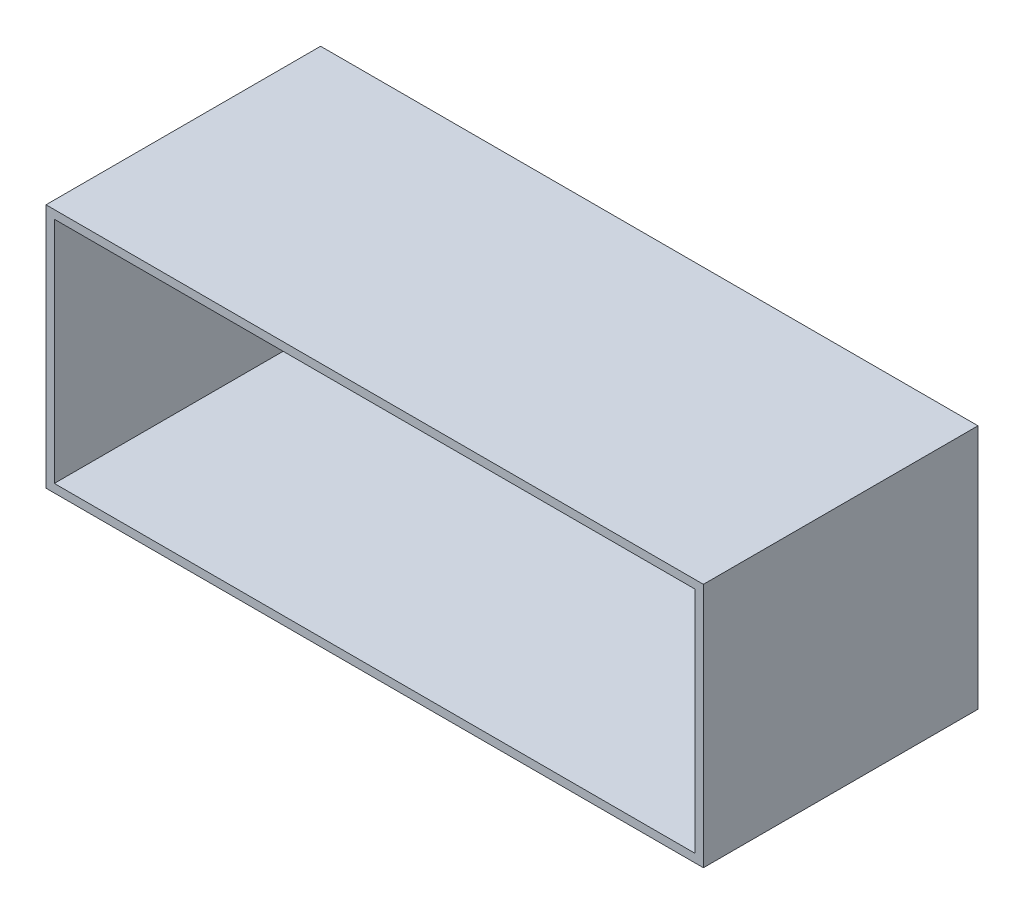
ISO-10303-21;
HEADER;
FILE_DESCRIPTION(('STEP AP214'),'2;1');
FILE_NAME('part.step','',(''),(''),'','','');
FILE_SCHEMA(('AUTOMOTIVE_DESIGN { 1 0 10303 214 1 1 1 1 }'));
ENDSEC;
DATA;
#1=APPLICATION_CONTEXT('core data for automotive mechanical design processes');
#2=APPLICATION_PROTOCOL_DEFINITION('international standard','automotive_design',2000,#1);
#3=PRODUCT_CONTEXT('',#1,'mechanical');
#4=PRODUCT('Part','Part','',(#3));
#5=PRODUCT_RELATED_PRODUCT_CATEGORY('part','',(#4));
#6=PRODUCT_DEFINITION_FORMATION('','',#4);
#7=PRODUCT_DEFINITION_CONTEXT('part definition',#1,'design');
#8=PRODUCT_DEFINITION('design','',#6,#7);
#9=PRODUCT_DEFINITION_SHAPE('','',#8);
#10=(LENGTH_UNIT() NAMED_UNIT(*) SI_UNIT(.MILLI.,.METRE.));
#11=(NAMED_UNIT(*) PLANE_ANGLE_UNIT() SI_UNIT($,.RADIAN.));
#12=(NAMED_UNIT(*) SI_UNIT($,.STERADIAN.) SOLID_ANGLE_UNIT());
#13=UNCERTAINTY_MEASURE_WITH_UNIT(LENGTH_MEASURE(1.E-05),#10,'distance_accuracy_value','');
#14=(GEOMETRIC_REPRESENTATION_CONTEXT(3) GLOBAL_UNCERTAINTY_ASSIGNED_CONTEXT((#13)) GLOBAL_UNIT_ASSIGNED_CONTEXT((#10,
#11,#12)) REPRESENTATION_CONTEXT('',''));
#15=CARTESIAN_POINT('',(0.,0.,0.));
#16=DIRECTION('',(0.,0.,1.));
#17=DIRECTION('',(1.,0.,0.));
#18=AXIS2_PLACEMENT_3D('',#15,#16,#17);
#19=CARTESIAN_POINT('',(0.,0.,66.));
#20=DIRECTION('',(0.,0.,-1.));
#21=DIRECTION('',(-1.,0.,0.));
#22=AXIS2_PLACEMENT_3D('',#19,#20,#21);
#23=PLANE('',#22);
#24=DIRECTION('',(0.,-1.,0.));
#25=VECTOR('',#24,1.);
#26=CARTESIAN_POINT('',(0.,0.,66.));
#27=LINE('',#26,#25);
#28=CARTESIAN_POINT('',(0.,59.,66.));
#29=VERTEX_POINT('',#28);
#30=CARTESIAN_POINT('',(0.,0.,66.));
#31=VERTEX_POINT('',#30);
#32=EDGE_CURVE('E144',#29,#31,#27,.T.);
#33=ORIENTED_EDGE('',*,*,#32,.T.);
#34=DIRECTION('',(1.,0.,0.));
#35=VECTOR('',#34,1.);
#36=CARTESIAN_POINT('',(0.,0.,66.));
#37=LINE('',#36,#35);
#38=CARTESIAN_POINT('',(158.,0.,66.));
#39=VERTEX_POINT('',#38);
#40=EDGE_CURVE('E149',#31,#39,#37,.T.);
#41=ORIENTED_EDGE('',*,*,#40,.T.);
#42=DIRECTION('',(0.,1.,0.));
#43=VECTOR('',#42,1.);
#44=CARTESIAN_POINT('',(158.,0.,66.));
#45=LINE('',#44,#43);
#46=CARTESIAN_POINT('',(158.,59.,66.));
#47=VERTEX_POINT('',#46);
#48=EDGE_CURVE('E152',#39,#47,#45,.T.);
#49=ORIENTED_EDGE('',*,*,#48,.T.);
#50=DIRECTION('',(-1.,0.,0.));
#51=VECTOR('',#50,1.);
#52=CARTESIAN_POINT('',(0.,59.,66.));
#53=LINE('',#52,#51);
#54=EDGE_CURVE('E153',#47,#29,#53,.T.);
#55=ORIENTED_EDGE('',*,*,#54,.T.);
#56=EDGE_LOOP('',(#33,#41,#49,#55));
#57=FACE_BOUND('',#56,.T.);
#58=DIRECTION('',(0.,-1.,0.));
#59=VECTOR('',#58,1.);
#60=CARTESIAN_POINT('',(2.,2.,66.));
#61=LINE('',#60,#59);
#62=CARTESIAN_POINT('',(2.,57.,66.));
#63=VERTEX_POINT('',#62);
#64=CARTESIAN_POINT('',(2.,2.,66.));
#65=VERTEX_POINT('',#64);
#66=EDGE_CURVE('E126',#63,#65,#61,.T.);
#67=ORIENTED_EDGE('',*,*,#66,.F.);
#68=DIRECTION('',(-1.,0.,0.));
#69=VECTOR('',#68,1.);
#70=CARTESIAN_POINT('',(2.,57.,66.));
#71=LINE('',#70,#69);
#72=CARTESIAN_POINT('',(156.,57.,66.));
#73=VERTEX_POINT('',#72);
#74=EDGE_CURVE('E118',#73,#63,#71,.T.);
#75=ORIENTED_EDGE('',*,*,#74,.F.);
#76=DIRECTION('',(0.,1.,0.));
#77=VECTOR('',#76,1.);
#78=CARTESIAN_POINT('',(156.,2.,66.));
#79=LINE('',#78,#77);
#80=CARTESIAN_POINT('',(156.,2.,66.));
#81=VERTEX_POINT('',#80);
#82=EDGE_CURVE('E136',#81,#73,#79,.T.);
#83=ORIENTED_EDGE('',*,*,#82,.F.);
#84=DIRECTION('',(1.,0.,0.));
#85=VECTOR('',#84,1.);
#86=CARTESIAN_POINT('',(2.,2.,66.));
#87=LINE('',#86,#85);
#88=EDGE_CURVE('E127',#65,#81,#87,.T.);
#89=ORIENTED_EDGE('',*,*,#88,.F.);
#90=EDGE_LOOP('',(#67,#75,#83,#89));
#91=FACE_BOUND('',#90,.T.);
#92=ADVANCED_FACE('F43',(#57,#91),#23,.F.);
#93=CARTESIAN_POINT('',(0.,0.,0.));
#94=DIRECTION('',(0.,0.,-1.));
#95=DIRECTION('',(-1.,0.,0.));
#96=AXIS2_PLACEMENT_3D('',#93,#94,#95);
#97=PLANE('',#96);
#98=DIRECTION('',(0.,-1.,0.));
#99=VECTOR('',#98,1.);
#100=CARTESIAN_POINT('',(0.,0.,0.));
#101=LINE('',#100,#99);
#102=CARTESIAN_POINT('',(0.,59.,0.));
#103=VERTEX_POINT('',#102);
#104=CARTESIAN_POINT('',(0.,0.,0.));
#105=VERTEX_POINT('',#104);
#106=EDGE_CURVE('E143',#103,#105,#101,.T.);
#107=ORIENTED_EDGE('',*,*,#106,.F.);
#108=DIRECTION('',(-1.,0.,0.));
#109=VECTOR('',#108,1.);
#110=CARTESIAN_POINT('',(0.,59.,0.));
#111=LINE('',#110,#109);
#112=CARTESIAN_POINT('',(158.,59.,0.));
#113=VERTEX_POINT('',#112);
#114=EDGE_CURVE('E146',#113,#103,#111,.T.);
#115=ORIENTED_EDGE('',*,*,#114,.F.);
#116=DIRECTION('',(0.,1.,0.));
#117=VECTOR('',#116,1.);
#118=CARTESIAN_POINT('',(158.,0.,0.));
#119=LINE('',#118,#117);
#120=CARTESIAN_POINT('',(158.,0.,0.));
#121=VERTEX_POINT('',#120);
#122=EDGE_CURVE('E158',#121,#113,#119,.T.);
#123=ORIENTED_EDGE('',*,*,#122,.F.);
#124=DIRECTION('',(1.,0.,0.));
#125=VECTOR('',#124,1.);
#126=CARTESIAN_POINT('',(0.,0.,0.));
#127=LINE('',#126,#125);
#128=EDGE_CURVE('E156',#105,#121,#127,.T.);
#129=ORIENTED_EDGE('',*,*,#128,.F.);
#130=EDGE_LOOP('',(#107,#115,#123,#129));
#131=FACE_BOUND('',#130,.T.);
#132=ADVANCED_FACE('F178',(#131),#97,.T.);
#133=CARTESIAN_POINT('',(0.,0.,66.));
#134=DIRECTION('',(1.,0.,0.));
#135=DIRECTION('',(0.,0.,-1.));
#136=AXIS2_PLACEMENT_3D('',#133,#134,#135);
#137=PLANE('',#136);
#138=ORIENTED_EDGE('',*,*,#106,.T.);
#139=DIRECTION('',(0.,0.,-1.));
#140=VECTOR('',#139,1.);
#141=CARTESIAN_POINT('',(0.,0.,66.));
#142=LINE('',#141,#140);
#143=EDGE_CURVE('E11',#31,#105,#142,.T.);
#144=ORIENTED_EDGE('',*,*,#143,.F.);
#145=ORIENTED_EDGE('',*,*,#32,.F.);
#146=DIRECTION('',(0.,0.,-1.));
#147=VECTOR('',#146,1.);
#148=CARTESIAN_POINT('',(0.,59.,66.));
#149=LINE('',#148,#147);
#150=EDGE_CURVE('E151',#29,#103,#149,.T.);
#151=ORIENTED_EDGE('',*,*,#150,.T.);
#152=EDGE_LOOP('',(#138,#144,#145,#151));
#153=FACE_BOUND('',#152,.T.);
#154=ADVANCED_FACE('F44',(#153),#137,.F.);
#155=CARTESIAN_POINT('',(0.,0.,66.));
#156=DIRECTION('',(0.,1.,0.));
#157=DIRECTION('',(0.,0.,1.));
#158=AXIS2_PLACEMENT_3D('',#155,#156,#157);
#159=PLANE('',#158);
#160=ORIENTED_EDGE('',*,*,#128,.T.);
#161=DIRECTION('',(0.,0.,-1.));
#162=VECTOR('',#161,1.);
#163=CARTESIAN_POINT('',(158.,0.,66.));
#164=LINE('',#163,#162);
#165=EDGE_CURVE('E51',#39,#121,#164,.T.);
#166=ORIENTED_EDGE('',*,*,#165,.F.);
#167=ORIENTED_EDGE('',*,*,#40,.F.);
#168=ORIENTED_EDGE('',*,*,#143,.T.);
#169=EDGE_LOOP('',(#160,#166,#167,#168));
#170=FACE_BOUND('',#169,.T.);
#171=ADVANCED_FACE('F187',(#170),#159,.F.);
#172=CARTESIAN_POINT('',(158.,0.,66.));
#173=DIRECTION('',(-1.,0.,0.));
#174=DIRECTION('',(0.,0.,1.));
#175=AXIS2_PLACEMENT_3D('',#172,#173,#174);
#176=PLANE('',#175);
#177=ORIENTED_EDGE('',*,*,#122,.T.);
#178=DIRECTION('',(0.,0.,-1.));
#179=VECTOR('',#178,1.);
#180=CARTESIAN_POINT('',(158.,59.,66.));
#181=LINE('',#180,#179);
#182=EDGE_CURVE('E164',#47,#113,#181,.T.);
#183=ORIENTED_EDGE('',*,*,#182,.F.);
#184=ORIENTED_EDGE('',*,*,#48,.F.);
#185=ORIENTED_EDGE('',*,*,#165,.T.);
#186=EDGE_LOOP('',(#177,#183,#184,#185));
#187=FACE_BOUND('',#186,.T.);
#188=ADVANCED_FACE('F175',(#187),#176,.F.);
#189=CARTESIAN_POINT('',(0.,59.,66.));
#190=DIRECTION('',(0.,-1.,0.));
#191=DIRECTION('',(0.,0.,-1.));
#192=AXIS2_PLACEMENT_3D('',#189,#190,#191);
#193=PLANE('',#192);
#194=ORIENTED_EDGE('',*,*,#114,.T.);
#195=ORIENTED_EDGE('',*,*,#150,.F.);
#196=ORIENTED_EDGE('',*,*,#54,.F.);
#197=ORIENTED_EDGE('',*,*,#182,.T.);
#198=EDGE_LOOP('',(#194,#195,#196,#197));
#199=FACE_BOUND('',#198,.T.);
#200=ADVANCED_FACE('F181',(#199),#193,.F.);
#201=CARTESIAN_POINT('',(2.,2.,66.));
#202=DIRECTION('',(1.,0.,0.));
#203=DIRECTION('',(0.,0.,-1.));
#204=AXIS2_PLACEMENT_3D('',#201,#202,#203);
#205=PLANE('',#204);
#206=DIRECTION('',(0.,-1.,0.));
#207=VECTOR('',#206,1.);
#208=CARTESIAN_POINT('',(2.,2.,2.));
#209=LINE('',#208,#207);
#210=CARTESIAN_POINT('',(2.,57.,2.));
#211=VERTEX_POINT('',#210);
#212=CARTESIAN_POINT('',(2.,2.,2.));
#213=VERTEX_POINT('',#212);
#214=EDGE_CURVE('E122',#211,#213,#209,.T.);
#215=ORIENTED_EDGE('',*,*,#214,.F.);
#216=DIRECTION('',(0.,0.,-1.));
#217=VECTOR('',#216,1.);
#218=CARTESIAN_POINT('',(2.,57.,66.));
#219=LINE('',#218,#217);
#220=EDGE_CURVE('E106',#63,#211,#219,.T.);
#221=ORIENTED_EDGE('',*,*,#220,.F.);
#222=ORIENTED_EDGE('',*,*,#66,.T.);
#223=DIRECTION('',(0.,0.,-1.));
#224=VECTOR('',#223,1.);
#225=CARTESIAN_POINT('',(2.,2.,66.));
#226=LINE('',#225,#224);
#227=EDGE_CURVE('E125',#65,#213,#226,.T.);
#228=ORIENTED_EDGE('',*,*,#227,.T.);
#229=EDGE_LOOP('',(#215,#221,#222,#228));
#230=FACE_BOUND('',#229,.T.);
#231=ADVANCED_FACE('F121',(#230),#205,.T.);
#232=CARTESIAN_POINT('',(2.,2.,66.));
#233=DIRECTION('',(0.,1.,0.));
#234=DIRECTION('',(0.,0.,1.));
#235=AXIS2_PLACEMENT_3D('',#232,#233,#234);
#236=PLANE('',#235);
#237=DIRECTION('',(1.,0.,0.));
#238=VECTOR('',#237,1.);
#239=CARTESIAN_POINT('',(2.,2.,2.));
#240=LINE('',#239,#238);
#241=CARTESIAN_POINT('',(156.,2.,2.));
#242=VERTEX_POINT('',#241);
#243=EDGE_CURVE('E59',#213,#242,#240,.T.);
#244=ORIENTED_EDGE('',*,*,#243,.F.);
#245=ORIENTED_EDGE('',*,*,#227,.F.);
#246=ORIENTED_EDGE('',*,*,#88,.T.);
#247=DIRECTION('',(0.,0.,-1.));
#248=VECTOR('',#247,1.);
#249=CARTESIAN_POINT('',(156.,2.,66.));
#250=LINE('',#249,#248);
#251=EDGE_CURVE('E141',#81,#242,#250,.T.);
#252=ORIENTED_EDGE('',*,*,#251,.T.);
#253=EDGE_LOOP('',(#244,#245,#246,#252));
#254=FACE_BOUND('',#253,.T.);
#255=ADVANCED_FACE('F206',(#254),#236,.T.);
#256=CARTESIAN_POINT('',(156.,2.,66.));
#257=DIRECTION('',(-1.,0.,0.));
#258=DIRECTION('',(0.,0.,1.));
#259=AXIS2_PLACEMENT_3D('',#256,#257,#258);
#260=PLANE('',#259);
#261=DIRECTION('',(0.,1.,0.));
#262=VECTOR('',#261,1.);
#263=CARTESIAN_POINT('',(156.,2.,2.));
#264=LINE('',#263,#262);
#265=CARTESIAN_POINT('',(156.,57.,2.));
#266=VERTEX_POINT('',#265);
#267=EDGE_CURVE('E67',#242,#266,#264,.T.);
#268=ORIENTED_EDGE('',*,*,#267,.F.);
#269=ORIENTED_EDGE('',*,*,#251,.F.);
#270=ORIENTED_EDGE('',*,*,#82,.T.);
#271=DIRECTION('',(0.,0.,-1.));
#272=VECTOR('',#271,1.);
#273=CARTESIAN_POINT('',(156.,57.,66.));
#274=LINE('',#273,#272);
#275=EDGE_CURVE('E117',#73,#266,#274,.T.);
#276=ORIENTED_EDGE('',*,*,#275,.T.);
#277=EDGE_LOOP('',(#268,#269,#270,#276));
#278=FACE_BOUND('',#277,.T.);
#279=ADVANCED_FACE('F212',(#278),#260,.T.);
#280=CARTESIAN_POINT('',(2.,57.,66.));
#281=DIRECTION('',(0.,-1.,0.));
#282=DIRECTION('',(0.,0.,-1.));
#283=AXIS2_PLACEMENT_3D('',#280,#281,#282);
#284=PLANE('',#283);
#285=DIRECTION('',(-1.,0.,0.));
#286=VECTOR('',#285,1.);
#287=CARTESIAN_POINT('',(2.,57.,2.));
#288=LINE('',#287,#286);
#289=EDGE_CURVE('E114',#266,#211,#288,.T.);
#290=ORIENTED_EDGE('',*,*,#289,.F.);
#291=ORIENTED_EDGE('',*,*,#275,.F.);
#292=ORIENTED_EDGE('',*,*,#74,.T.);
#293=ORIENTED_EDGE('',*,*,#220,.T.);
#294=EDGE_LOOP('',(#290,#291,#292,#293));
#295=FACE_BOUND('',#294,.T.);
#296=ADVANCED_FACE('F115',(#295),#284,.T.);
#297=CARTESIAN_POINT('',(0.,0.,2.));
#298=DIRECTION('',(0.,0.,-1.));
#299=DIRECTION('',(-1.,0.,0.));
#300=AXIS2_PLACEMENT_3D('',#297,#298,#299);
#301=PLANE('',#300);
#302=ORIENTED_EDGE('',*,*,#214,.T.);
#303=ORIENTED_EDGE('',*,*,#243,.T.);
#304=ORIENTED_EDGE('',*,*,#267,.T.);
#305=ORIENTED_EDGE('',*,*,#289,.T.);
#306=EDGE_LOOP('',(#302,#303,#304,#305));
#307=FACE_BOUND('',#306,.T.);
#308=ADVANCED_FACE('F130',(#307),#301,.F.);
#309=CLOSED_SHELL('',(#92,#132,#154,#171,#188,#200,#231,#255,#279,#296,#308));
#310=MANIFOLD_SOLID_BREP('B2',#309);
#311=ADVANCED_BREP_SHAPE_REPRESENTATION('',(#18,#310),#14);
#312=SHAPE_DEFINITION_REPRESENTATION(#9,#311);
ENDSEC;
END-ISO-10303-21;
